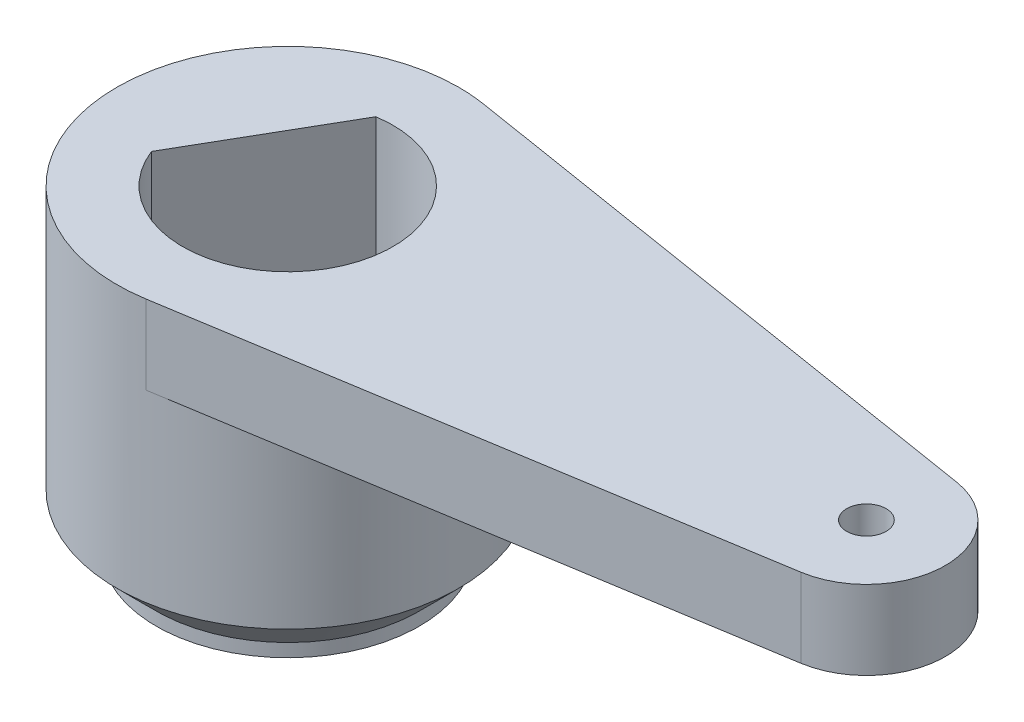
ISO-10303-21;
HEADER;
FILE_DESCRIPTION(('STEP AP214'),'2;1');
FILE_NAME('part.step','',(''),(''),'','','');
FILE_SCHEMA(('AUTOMOTIVE_DESIGN { 1 0 10303 214 1 1 1 1 }'));
ENDSEC;
DATA;
#1=APPLICATION_CONTEXT('core data for automotive mechanical design processes');
#2=APPLICATION_PROTOCOL_DEFINITION('international standard','automotive_design',2000,#1);
#3=PRODUCT_CONTEXT('',#1,'mechanical');
#4=PRODUCT('Part','Part','',(#3));
#5=PRODUCT_RELATED_PRODUCT_CATEGORY('part','',(#4));
#6=PRODUCT_DEFINITION_FORMATION('','',#4);
#7=PRODUCT_DEFINITION_CONTEXT('part definition',#1,'design');
#8=PRODUCT_DEFINITION('design','',#6,#7);
#9=PRODUCT_DEFINITION_SHAPE('','',#8);
#10=(LENGTH_UNIT() NAMED_UNIT(*) SI_UNIT(.MILLI.,.METRE.));
#11=(NAMED_UNIT(*) PLANE_ANGLE_UNIT() SI_UNIT($,.RADIAN.));
#12=(NAMED_UNIT(*) SI_UNIT($,.STERADIAN.) SOLID_ANGLE_UNIT());
#13=UNCERTAINTY_MEASURE_WITH_UNIT(LENGTH_MEASURE(1.E-05),#10,'distance_accuracy_value','');
#14=(GEOMETRIC_REPRESENTATION_CONTEXT(3) GLOBAL_UNCERTAINTY_ASSIGNED_CONTEXT((#13)) GLOBAL_UNIT_ASSIGNED_CONTEXT((#10,
#11,#12)) REPRESENTATION_CONTEXT('',''));
#15=CARTESIAN_POINT('',(0.,0.,0.));
#16=DIRECTION('',(0.,0.,1.));
#17=DIRECTION('',(1.,0.,0.));
#18=AXIS2_PLACEMENT_3D('',#15,#16,#17);
#19=CARTESIAN_POINT('',(0.,12.,0.));
#20=DIRECTION('',(0.,-1.,0.));
#21=DIRECTION('',(0.,0.,-1.));
#22=AXIS2_PLACEMENT_3D('',#19,#20,#21);
#23=CYLINDRICAL_SURFACE('',#22,4.);
#24=CARTESIAN_POINT('',(0.,0.,0.));
#25=DIRECTION('',(0.,1.,0.));
#26=DIRECTION('',(0.,0.,1.));
#27=AXIS2_PLACEMENT_3D('',#24,#25,#26);
#28=CIRCLE('',#27,4.);
#29=CARTESIAN_POINT('',(0.,0.,4.));
#30=VERTEX_POINT('',#29);
#31=EDGE_CURVE('E100',#30,#30,#28,.T.);
#32=ORIENTED_EDGE('',*,*,#31,.F.);
#33=EDGE_LOOP('',(#32));
#34=FACE_BOUND('',#33,.T.);
#35=CARTESIAN_POINT('',(0.,12.,0.));
#36=DIRECTION('',(0.,1.,0.));
#37=DIRECTION('',(0.,0.,1.));
#38=AXIS2_PLACEMENT_3D('',#35,#36,#37);
#39=CIRCLE('',#38,4.);
#40=CARTESIAN_POINT('',(-3.72631300906069,12.,1.45416345659802));
#41=VERTEX_POINT('',#40);
#42=CARTESIAN_POINT('',(-0.60381400986152,12.,-3.95416345659799));
#43=VERTEX_POINT('',#42);
#44=EDGE_CURVE('E95',#41,#43,#39,.T.);
#45=ORIENTED_EDGE('',*,*,#44,.T.);
#46=DIRECTION('',(0.,1.,0.));
#47=VECTOR('',#46,1.);
#48=CARTESIAN_POINT('',(-0.60381400986152,2.,-3.95416345659799));
#49=LINE('',#48,#47);
#50=CARTESIAN_POINT('',(-0.60381400986152,2.,-3.95416345659799));
#51=VERTEX_POINT('',#50);
#52=EDGE_CURVE('E64',#51,#43,#49,.T.);
#53=ORIENTED_EDGE('',*,*,#52,.F.);
#54=CARTESIAN_POINT('',(0.,2.,0.));
#55=DIRECTION('',(0.,1.,0.));
#56=DIRECTION('',(0.,0.,1.));
#57=AXIS2_PLACEMENT_3D('',#54,#55,#56);
#58=CIRCLE('',#57,4.);
#59=CARTESIAN_POINT('',(-3.72631300906069,2.,1.45416345659802));
#60=VERTEX_POINT('',#59);
#61=EDGE_CURVE('E59',#60,#51,#58,.F.);
#62=ORIENTED_EDGE('',*,*,#61,.F.);
#63=DIRECTION('',(0.,1.,0.));
#64=VECTOR('',#63,1.);
#65=CARTESIAN_POINT('',(-3.72631300906069,2.,1.45416345659802));
#66=LINE('',#65,#64);
#67=EDGE_CURVE('E103',#60,#41,#66,.T.);
#68=ORIENTED_EDGE('',*,*,#67,.T.);
#69=EDGE_LOOP('',(#45,#53,#62,#68));
#70=FACE_BOUND('',#69,.T.);
#71=ADVANCED_FACE('F43',(#34,#70),#23,.F.);
#72=CARTESIAN_POINT('',(0.,12.,0.));
#73=DIRECTION('',(0.,-1.,0.));
#74=DIRECTION('',(0.,0.,-1.));
#75=AXIS2_PLACEMENT_3D('',#72,#73,#74);
#76=CYLINDRICAL_SURFACE('',#75,6.5);
#77=DIRECTION('',(0.,1.,0.));
#78=VECTOR('',#77,1.);
#79=CARTESIAN_POINT('',(1.03409090909091,9.,6.41721559492398));
#80=LINE('',#79,#78);
#81=CARTESIAN_POINT('',(1.03409090909091,9.,6.41721559492398));
#82=VERTEX_POINT('',#81);
#83=CARTESIAN_POINT('',(1.03409090909091,12.,6.41721559492398));
#84=VERTEX_POINT('',#83);
#85=EDGE_CURVE('E147',#82,#84,#80,.T.);
#86=ORIENTED_EDGE('',*,*,#85,.T.);
#87=CARTESIAN_POINT('',(0.,12.,0.));
#88=DIRECTION('',(0.,1.,0.));
#89=DIRECTION('',(0.,0.,1.));
#90=AXIS2_PLACEMENT_3D('',#87,#88,#89);
#91=CIRCLE('',#90,6.5);
#92=CARTESIAN_POINT('',(1.03409090909091,12.,-6.41721559492398));
#93=VERTEX_POINT('',#92);
#94=EDGE_CURVE('E52',#93,#84,#91,.T.);
#95=ORIENTED_EDGE('',*,*,#94,.F.);
#96=DIRECTION('',(0.,1.,0.));
#97=VECTOR('',#96,1.);
#98=CARTESIAN_POINT('',(1.03409090909091,9.,-6.41721559492398));
#99=LINE('',#98,#97);
#100=CARTESIAN_POINT('',(1.03409090909091,9.,-6.41721559492398));
#101=VERTEX_POINT('',#100);
#102=EDGE_CURVE('E150',#101,#93,#99,.T.);
#103=ORIENTED_EDGE('',*,*,#102,.F.);
#104=CARTESIAN_POINT('',(0.,9.,0.));
#105=DIRECTION('',(0.,1.,0.));
#106=DIRECTION('',(0.,0.,1.));
#107=AXIS2_PLACEMENT_3D('',#104,#105,#106);
#108=CIRCLE('',#107,6.5);
#109=EDGE_CURVE('E133',#82,#101,#108,.T.);
#110=ORIENTED_EDGE('',*,*,#109,.F.);
#111=EDGE_LOOP('',(#86,#95,#103,#110));
#112=FACE_BOUND('',#111,.T.);
#113=CARTESIAN_POINT('',(0.,2.,0.));
#114=DIRECTION('',(0.,-1.,0.));
#115=DIRECTION('',(0.,0.,-1.));
#116=AXIS2_PLACEMENT_3D('',#113,#114,#115);
#117=CIRCLE('',#116,6.5);
#118=CARTESIAN_POINT('',(0.,2.,-6.5));
#119=VERTEX_POINT('',#118);
#120=EDGE_CURVE('E115',#119,#119,#117,.T.);
#121=ORIENTED_EDGE('',*,*,#120,.F.);
#122=EDGE_LOOP('',(#121));
#123=FACE_BOUND('',#122,.T.);
#124=ADVANCED_FACE('F162',(#112,#123),#76,.T.);
#125=CARTESIAN_POINT('',(0.,0.,0.));
#126=DIRECTION('',(0.,1.,0.));
#127=DIRECTION('',(0.,0.,1.));
#128=AXIS2_PLACEMENT_3D('',#125,#126,#127);
#129=PLANE('',#128);
#130=ORIENTED_EDGE('',*,*,#31,.T.);
#131=EDGE_LOOP('',(#130));
#132=FACE_BOUND('',#131,.T.);
#133=CARTESIAN_POINT('',(0.,0.,0.));
#134=DIRECTION('',(0.,-1.,0.));
#135=DIRECTION('',(0.,0.,-1.));
#136=AXIS2_PLACEMENT_3D('',#133,#134,#135);
#137=CIRCLE('',#136,5.);
#138=CARTESIAN_POINT('',(0.,0.,-5.));
#139=VERTEX_POINT('',#138);
#140=EDGE_CURVE('E106',#139,#139,#137,.T.);
#141=ORIENTED_EDGE('',*,*,#140,.T.);
#142=EDGE_LOOP('',(#141));
#143=FACE_BOUND('',#142,.T.);
#144=ADVANCED_FACE('F197',(#132,#143),#129,.F.);
#145=CARTESIAN_POINT('',(0.,12.,0.));
#146=DIRECTION('',(0.,1.,0.));
#147=DIRECTION('',(0.,0.,1.));
#148=AXIS2_PLACEMENT_3D('',#145,#146,#147);
#149=PLANE('',#148);
#150=ORIENTED_EDGE('',*,*,#94,.T.);
#151=DIRECTION('',(0.987263937680612,0.,-0.159090909090909));
#152=VECTOR('',#151,1.);
#153=CARTESIAN_POINT('',(1.03409090909091,12.,6.41721559492398));
#154=LINE('',#153,#152);
#155=CARTESIAN_POINT('',(22.4772727272727,12.,2.96179181304184));
#156=VERTEX_POINT('',#155);
#157=EDGE_CURVE('E139',#84,#156,#154,.T.);
#158=ORIENTED_EDGE('',*,*,#157,.T.);
#159=CARTESIAN_POINT('',(22.,12.,0.));
#160=DIRECTION('',(0.,1.,0.));
#161=DIRECTION('',(0.,0.,1.));
#162=AXIS2_PLACEMENT_3D('',#159,#160,#161);
#163=CIRCLE('',#162,3.);
#164=CARTESIAN_POINT('',(22.4772727272727,12.,-2.96179181304184));
#165=VERTEX_POINT('',#164);
#166=EDGE_CURVE('E142',#156,#165,#163,.T.);
#167=ORIENTED_EDGE('',*,*,#166,.T.);
#168=DIRECTION('',(0.987263937680612,0.,0.159090909090909));
#169=VECTOR('',#168,1.);
#170=CARTESIAN_POINT('',(1.03409090909091,12.,-6.41721559492398));
#171=LINE('',#170,#169);
#172=EDGE_CURVE('E125',#93,#165,#171,.T.);
#173=ORIENTED_EDGE('',*,*,#172,.F.);
#174=EDGE_LOOP('',(#150,#158,#167,#173));
#175=FACE_BOUND('',#174,.T.);
#176=ORIENTED_EDGE('',*,*,#44,.F.);
#177=DIRECTION('',(-0.499999999999995,0.,0.866025403784442));
#178=VECTOR('',#177,1.);
#179=CARTESIAN_POINT('',(-2.1650635094611,12.,-1.24999999999999));
#180=LINE('',#179,#178);
#181=EDGE_CURVE('E99',#43,#41,#180,.T.);
#182=ORIENTED_EDGE('',*,*,#181,.F.);
#183=EDGE_LOOP('',(#176,#182));
#184=FACE_BOUND('',#183,.T.);
#185=CARTESIAN_POINT('',(22.,12.,0.));
#186=DIRECTION('',(0.,1.,0.));
#187=DIRECTION('',(0.,0.,1.));
#188=AXIS2_PLACEMENT_3D('',#185,#186,#187);
#189=CIRCLE('',#188,0.750000000000002);
#190=CARTESIAN_POINT('',(22.,12.,0.750000000000002));
#191=VERTEX_POINT('',#190);
#192=EDGE_CURVE('E118',#191,#191,#189,.T.);
#193=ORIENTED_EDGE('',*,*,#192,.F.);
#194=EDGE_LOOP('',(#193));
#195=FACE_BOUND('',#194,.T.);
#196=ADVANCED_FACE('F96',(#175,#184,#195),#149,.T.);
#197=CARTESIAN_POINT('',(1.03409090909091,9.,6.41721559492398));
#198=DIRECTION('',(0.159090909090909,0.,0.987263937680612));
#199=DIRECTION('',(0.987263937680612,0.,-0.159090909090909));
#200=AXIS2_PLACEMENT_3D('',#197,#198,#199);
#201=PLANE('',#200);
#202=ORIENTED_EDGE('',*,*,#157,.F.);
#203=ORIENTED_EDGE('',*,*,#85,.F.);
#204=DIRECTION('',(0.987263937680612,0.,-0.159090909090909));
#205=VECTOR('',#204,1.);
#206=CARTESIAN_POINT('',(1.03409090909091,9.,6.41721559492398));
#207=LINE('',#206,#205);
#208=CARTESIAN_POINT('',(22.4772727272727,9.,2.96179181304184));
#209=VERTEX_POINT('',#208);
#210=EDGE_CURVE('E124',#82,#209,#207,.T.);
#211=ORIENTED_EDGE('',*,*,#210,.T.);
#212=DIRECTION('',(0.,1.,0.));
#213=VECTOR('',#212,1.);
#214=CARTESIAN_POINT('',(22.4772727272727,9.,2.96179181304184));
#215=LINE('',#214,#213);
#216=EDGE_CURVE('E136',#209,#156,#215,.T.);
#217=ORIENTED_EDGE('',*,*,#216,.T.);
#218=EDGE_LOOP('',(#202,#203,#211,#217));
#219=FACE_BOUND('',#218,.T.);
#220=ADVANCED_FACE('F167',(#219),#201,.T.);
#221=CARTESIAN_POINT('',(1.03409090909091,9.,-6.41721559492398));
#222=DIRECTION('',(-0.159090909090909,0.,0.987263937680612));
#223=DIRECTION('',(0.987263937680612,0.,0.159090909090909));
#224=AXIS2_PLACEMENT_3D('',#221,#222,#223);
#225=PLANE('',#224);
#226=ORIENTED_EDGE('',*,*,#172,.T.);
#227=DIRECTION('',(0.,1.,0.));
#228=VECTOR('',#227,1.);
#229=CARTESIAN_POINT('',(22.4772727272727,9.,-2.96179181304184));
#230=LINE('',#229,#228);
#231=CARTESIAN_POINT('',(22.4772727272727,9.,-2.96179181304184));
#232=VERTEX_POINT('',#231);
#233=EDGE_CURVE('E152',#232,#165,#230,.T.);
#234=ORIENTED_EDGE('',*,*,#233,.F.);
#235=DIRECTION('',(0.987263937680612,0.,0.159090909090909));
#236=VECTOR('',#235,1.);
#237=CARTESIAN_POINT('',(1.03409090909091,9.,-6.41721559492398));
#238=LINE('',#237,#236);
#239=EDGE_CURVE('E131',#101,#232,#238,.T.);
#240=ORIENTED_EDGE('',*,*,#239,.F.);
#241=ORIENTED_EDGE('',*,*,#102,.T.);
#242=EDGE_LOOP('',(#226,#234,#240,#241));
#243=FACE_BOUND('',#242,.T.);
#244=ADVANCED_FACE('F176',(#243),#225,.F.);
#245=CARTESIAN_POINT('',(22.,9.,0.));
#246=DIRECTION('',(0.,1.,0.));
#247=DIRECTION('',(0.,0.,1.));
#248=AXIS2_PLACEMENT_3D('',#245,#246,#247);
#249=CYLINDRICAL_SURFACE('',#248,0.750000000000002);
#250=CARTESIAN_POINT('',(22.,9.,0.));
#251=DIRECTION('',(0.,1.,0.));
#252=DIRECTION('',(0.,0.,1.));
#253=AXIS2_PLACEMENT_3D('',#250,#251,#252);
#254=CIRCLE('',#253,0.750000000000002);
#255=CARTESIAN_POINT('',(22.,9.,0.750000000000002));
#256=VERTEX_POINT('',#255);
#257=EDGE_CURVE('E121',#256,#256,#254,.T.);
#258=ORIENTED_EDGE('',*,*,#257,.F.);
#259=EDGE_LOOP('',(#258));
#260=FACE_BOUND('',#259,.T.);
#261=ORIENTED_EDGE('',*,*,#192,.T.);
#262=EDGE_LOOP('',(#261));
#263=FACE_BOUND('',#262,.T.);
#264=ADVANCED_FACE('F178',(#260,#263),#249,.F.);
#265=CARTESIAN_POINT('',(22.,9.,0.));
#266=DIRECTION('',(0.,1.,0.));
#267=DIRECTION('',(0.,0.,1.));
#268=AXIS2_PLACEMENT_3D('',#265,#266,#267);
#269=CYLINDRICAL_SURFACE('',#268,3.);
#270=ORIENTED_EDGE('',*,*,#166,.F.);
#271=ORIENTED_EDGE('',*,*,#216,.F.);
#272=CARTESIAN_POINT('',(22.,9.,0.));
#273=DIRECTION('',(0.,1.,0.));
#274=DIRECTION('',(0.,0.,1.));
#275=AXIS2_PLACEMENT_3D('',#272,#273,#274);
#276=CIRCLE('',#275,3.);
#277=EDGE_CURVE('E128',#209,#232,#276,.T.);
#278=ORIENTED_EDGE('',*,*,#277,.T.);
#279=ORIENTED_EDGE('',*,*,#233,.T.);
#280=EDGE_LOOP('',(#270,#271,#278,#279));
#281=FACE_BOUND('',#280,.T.);
#282=ADVANCED_FACE('F174',(#281),#269,.T.);
#283=CARTESIAN_POINT('',(0.,9.,0.));
#284=DIRECTION('',(0.,1.,0.));
#285=DIRECTION('',(0.,0.,1.));
#286=AXIS2_PLACEMENT_3D('',#283,#284,#285);
#287=PLANE('',#286);
#288=ORIENTED_EDGE('',*,*,#257,.T.);
#289=EDGE_LOOP('',(#288));
#290=FACE_BOUND('',#289,.T.);
#291=ORIENTED_EDGE('',*,*,#210,.F.);
#292=ORIENTED_EDGE('',*,*,#109,.T.);
#293=ORIENTED_EDGE('',*,*,#239,.T.);
#294=ORIENTED_EDGE('',*,*,#277,.F.);
#295=EDGE_LOOP('',(#291,#292,#293,#294));
#296=FACE_BOUND('',#295,.T.);
#297=ADVANCED_FACE('F170',(#290,#296),#287,.F.);
#298=CARTESIAN_POINT('',(0.,2.,0.));
#299=DIRECTION('',(0.,-1.,0.));
#300=DIRECTION('',(0.,0.,-1.));
#301=AXIS2_PLACEMENT_3D('',#298,#299,#300);
#302=CYLINDRICAL_SURFACE('',#301,5.);
#303=CARTESIAN_POINT('',(0.,0.499999999999991,0.));
#304=DIRECTION('',(0.,-1.,0.));
#305=DIRECTION('',(0.,0.,-1.));
#306=AXIS2_PLACEMENT_3D('',#303,#304,#305);
#307=CIRCLE('',#306,5.);
#308=CARTESIAN_POINT('',(0.,0.499999999999991,-5.));
#309=VERTEX_POINT('',#308);
#310=EDGE_CURVE('E11',#309,#309,#307,.T.);
#311=ORIENTED_EDGE('',*,*,#310,.T.);
#312=EDGE_LOOP('',(#311));
#313=FACE_BOUND('',#312,.T.);
#314=ORIENTED_EDGE('',*,*,#140,.F.);
#315=EDGE_LOOP('',(#314));
#316=FACE_BOUND('',#315,.T.);
#317=ADVANCED_FACE('F207',(#313,#316),#302,.T.);
#318=CARTESIAN_POINT('',(-2.1650635094611,2.,-1.24999999999999));
#319=DIRECTION('',(-0.866025403784442,0.,-0.499999999999995));
#320=DIRECTION('',(-0.499999999999995,0.,0.866025403784442));
#321=AXIS2_PLACEMENT_3D('',#318,#319,#320);
#322=PLANE('',#321);
#323=ORIENTED_EDGE('',*,*,#181,.T.);
#324=ORIENTED_EDGE('',*,*,#67,.F.);
#325=DIRECTION('',(-0.499999999999995,0.,0.866025403784442));
#326=VECTOR('',#325,1.);
#327=CARTESIAN_POINT('',(-2.1650635094611,2.,-1.24999999999999));
#328=LINE('',#327,#326);
#329=EDGE_CURVE('E109',#51,#60,#328,.T.);
#330=ORIENTED_EDGE('',*,*,#329,.F.);
#331=ORIENTED_EDGE('',*,*,#52,.T.);
#332=EDGE_LOOP('',(#323,#324,#330,#331));
#333=FACE_BOUND('',#332,.T.);
#334=ADVANCED_FACE('F108',(#333),#322,.F.);
#335=CARTESIAN_POINT('',(0.,2.,0.));
#336=DIRECTION('',(0.,1.,0.));
#337=DIRECTION('',(0.,0.,1.));
#338=AXIS2_PLACEMENT_3D('',#335,#336,#337);
#339=PLANE('',#338);
#340=ORIENTED_EDGE('',*,*,#329,.T.);
#341=ORIENTED_EDGE('',*,*,#61,.T.);
#342=EDGE_LOOP('',(#340,#341));
#343=FACE_BOUND('',#342,.T.);
#344=ADVANCED_FACE('F216',(#343),#339,.F.);
#345=CARTESIAN_POINT('',(0.,0.499999999999991,0.));
#346=DIRECTION('',(0.,1.,0.));
#347=DIRECTION('',(0.,0.,1.));
#348=AXIS2_PLACEMENT_3D('',#345,#346,#347);
#349=CONICAL_SURFACE('',#348,5.,0.785398163397444);
#350=ORIENTED_EDGE('',*,*,#120,.T.);
#351=EDGE_LOOP('',(#350));
#352=FACE_BOUND('',#351,.T.);
#353=ORIENTED_EDGE('',*,*,#310,.F.);
#354=EDGE_LOOP('',(#353));
#355=FACE_BOUND('',#354,.T.);
#356=ADVANCED_FACE('F46',(#352,#355),#349,.T.);
#357=CLOSED_SHELL('',(#71,#124,#144,#196,#220,#244,#264,#282,#297,#317,#334,#344,#356));
#358=MANIFOLD_SOLID_BREP('B2',#357);
#359=ADVANCED_BREP_SHAPE_REPRESENTATION('',(#18,#358),#14);
#360=SHAPE_DEFINITION_REPRESENTATION(#9,#359);
ENDSEC;
END-ISO-10303-21;
